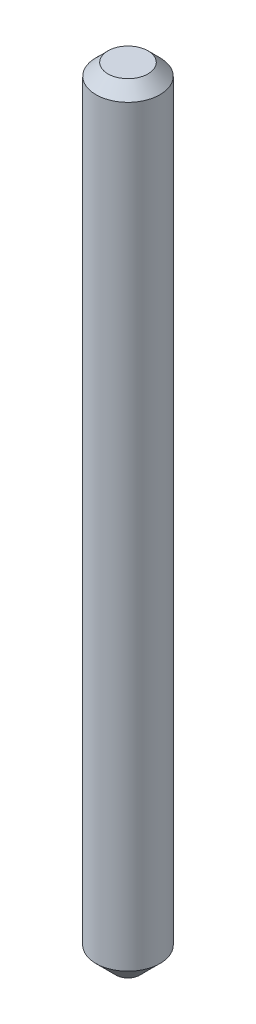
ISO-10303-21;
HEADER;
FILE_DESCRIPTION(('STEP AP214'),'2;1');
FILE_NAME('part.step','',(''),(''),'','','');
FILE_SCHEMA(('AUTOMOTIVE_DESIGN { 1 0 10303 214 1 1 1 1 }'));
ENDSEC;
DATA;
#1=APPLICATION_CONTEXT('core data for automotive mechanical design processes');
#2=APPLICATION_PROTOCOL_DEFINITION('international standard','automotive_design',2000,#1);
#3=PRODUCT_CONTEXT('',#1,'mechanical');
#4=PRODUCT('Part','Part','',(#3));
#5=PRODUCT_RELATED_PRODUCT_CATEGORY('part','',(#4));
#6=PRODUCT_DEFINITION_FORMATION('','',#4);
#7=PRODUCT_DEFINITION_CONTEXT('part definition',#1,'design');
#8=PRODUCT_DEFINITION('design','',#6,#7);
#9=PRODUCT_DEFINITION_SHAPE('','',#8);
#10=(LENGTH_UNIT() NAMED_UNIT(*) SI_UNIT(.MILLI.,.METRE.));
#11=(NAMED_UNIT(*) PLANE_ANGLE_UNIT() SI_UNIT($,.RADIAN.));
#12=(NAMED_UNIT(*) SI_UNIT($,.STERADIAN.) SOLID_ANGLE_UNIT());
#13=UNCERTAINTY_MEASURE_WITH_UNIT(LENGTH_MEASURE(1.E-05),#10,'distance_accuracy_value','');
#14=(GEOMETRIC_REPRESENTATION_CONTEXT(3) GLOBAL_UNCERTAINTY_ASSIGNED_CONTEXT((#13)) GLOBAL_UNIT_ASSIGNED_CONTEXT((#10,
#11,#12)) REPRESENTATION_CONTEXT('',''));
#15=CARTESIAN_POINT('',(0.,0.,0.));
#16=DIRECTION('',(0.,0.,1.));
#17=DIRECTION('',(1.,0.,0.));
#18=AXIS2_PLACEMENT_3D('',#15,#16,#17);
#19=CARTESIAN_POINT('',(0.,98.,0.));
#20=DIRECTION('',(0.,-1.,0.));
#21=DIRECTION('',(0.,0.,-1.));
#22=AXIS2_PLACEMENT_3D('',#19,#20,#21);
#23=CYLINDRICAL_SURFACE('',#22,4.);
#24=CARTESIAN_POINT('',(0.,96.5,0.));
#25=DIRECTION('',(0.,1.,0.));
#26=DIRECTION('',(0.,0.,1.));
#27=AXIS2_PLACEMENT_3D('',#24,#25,#26);
#28=CIRCLE('',#27,4.);
#29=CARTESIAN_POINT('',(0.,96.5,4.));
#30=VERTEX_POINT('',#29);
#31=EDGE_CURVE('E10',#30,#30,#28,.F.);
#32=ORIENTED_EDGE('',*,*,#31,.T.);
#33=EDGE_LOOP('',(#32));
#34=FACE_BOUND('',#33,.T.);
#35=CARTESIAN_POINT('',(0.,2.50000000000002,0.));
#36=DIRECTION('',(0.,1.,0.));
#37=DIRECTION('',(0.,0.,1.));
#38=AXIS2_PLACEMENT_3D('',#35,#36,#37);
#39=CIRCLE('',#38,4.);
#40=CARTESIAN_POINT('',(0.,2.50000000000002,4.));
#41=VERTEX_POINT('',#40);
#42=EDGE_CURVE('E49',#41,#41,#39,.T.);
#43=ORIENTED_EDGE('',*,*,#42,.T.);
#44=EDGE_LOOP('',(#43));
#45=FACE_BOUND('',#44,.T.);
#46=ADVANCED_FACE('F33',(#34,#45),#23,.T.);
#47=CARTESIAN_POINT('',(0.,98.,0.));
#48=DIRECTION('',(0.,1.,0.));
#49=DIRECTION('',(0.,0.,1.));
#50=AXIS2_PLACEMENT_3D('',#47,#48,#49);
#51=PLANE('',#50);
#52=CARTESIAN_POINT('',(0.,98.,0.));
#53=DIRECTION('',(0.,1.,0.));
#54=DIRECTION('',(0.,0.,1.));
#55=AXIS2_PLACEMENT_3D('',#52,#53,#54);
#56=CIRCLE('',#55,2.5);
#57=CARTESIAN_POINT('',(0.,98.,2.5));
#58=VERTEX_POINT('',#57);
#59=EDGE_CURVE('E41',#58,#58,#56,.T.);
#60=ORIENTED_EDGE('',*,*,#59,.T.);
#61=EDGE_LOOP('',(#60));
#62=FACE_BOUND('',#61,.T.);
#63=ADVANCED_FACE('F65',(#62),#51,.T.);
#64=CARTESIAN_POINT('',(0.,0.,0.));
#65=DIRECTION('',(0.,1.,0.));
#66=DIRECTION('',(0.,0.,1.));
#67=AXIS2_PLACEMENT_3D('',#64,#65,#66);
#68=PLANE('',#67);
#69=CARTESIAN_POINT('',(0.,0.,0.));
#70=DIRECTION('',(0.,1.,0.));
#71=DIRECTION('',(0.,0.,1.));
#72=AXIS2_PLACEMENT_3D('',#69,#70,#71);
#73=CIRCLE('',#72,1.49999999999999);
#74=CARTESIAN_POINT('',(0.,0.,1.49999999999999));
#75=VERTEX_POINT('',#74);
#76=EDGE_CURVE('E45',#75,#75,#73,.F.);
#77=ORIENTED_EDGE('',*,*,#76,.T.);
#78=EDGE_LOOP('',(#77));
#79=FACE_BOUND('',#78,.T.);
#80=ADVANCED_FACE('F58',(#79),#68,.F.);
#81=CARTESIAN_POINT('',(0.,2.50000000000002,0.));
#82=DIRECTION('',(0.,1.,0.));
#83=DIRECTION('',(0.,0.,1.));
#84=AXIS2_PLACEMENT_3D('',#81,#82,#83);
#85=CONICAL_SURFACE('',#84,4.,0.785398163397448);
#86=ORIENTED_EDGE('',*,*,#76,.F.);
#87=EDGE_LOOP('',(#86));
#88=FACE_BOUND('',#87,.T.);
#89=ORIENTED_EDGE('',*,*,#42,.F.);
#90=EDGE_LOOP('',(#89));
#91=FACE_BOUND('',#90,.T.);
#92=ADVANCED_FACE('F56',(#88,#91),#85,.T.);
#93=CARTESIAN_POINT('',(0.,98.,0.));
#94=DIRECTION('',(0.,-1.,0.));
#95=DIRECTION('',(0.,0.,-1.));
#96=AXIS2_PLACEMENT_3D('',#93,#94,#95);
#97=CONICAL_SURFACE('',#96,2.5,0.785398163397443);
#98=ORIENTED_EDGE('',*,*,#31,.F.);
#99=EDGE_LOOP('',(#98));
#100=FACE_BOUND('',#99,.T.);
#101=ORIENTED_EDGE('',*,*,#59,.F.);
#102=EDGE_LOOP('',(#101));
#103=FACE_BOUND('',#102,.T.);
#104=ADVANCED_FACE('F36',(#100,#103),#97,.T.);
#105=CLOSED_SHELL('',(#46,#63,#80,#92,#104));
#106=MANIFOLD_SOLID_BREP('B2',#105);
#107=ADVANCED_BREP_SHAPE_REPRESENTATION('',(#18,#106),#14);
#108=SHAPE_DEFINITION_REPRESENTATION(#9,#107);
ENDSEC;
END-ISO-10303-21;
